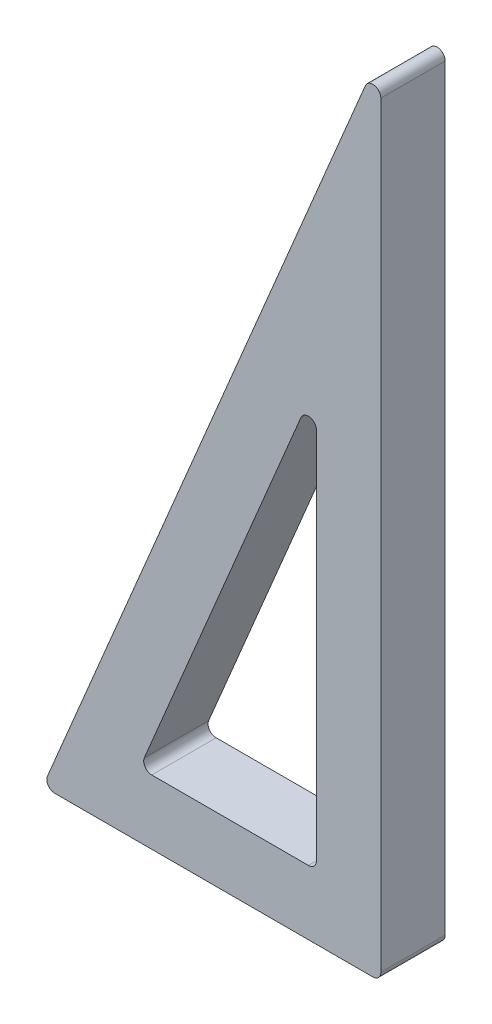
ISO-10303-21;
HEADER;
FILE_DESCRIPTION(('STEP AP214'),'2;1');
FILE_NAME('part.step','',(''),(''),'','','');
FILE_SCHEMA(('AUTOMOTIVE_DESIGN { 1 0 10303 214 1 1 1 1 }'));
ENDSEC;
DATA;
#1=APPLICATION_CONTEXT('core data for automotive mechanical design processes');
#2=APPLICATION_PROTOCOL_DEFINITION('international standard','automotive_design',2000,#1);
#3=PRODUCT_CONTEXT('',#1,'mechanical');
#4=PRODUCT('Part','Part','',(#3));
#5=PRODUCT_RELATED_PRODUCT_CATEGORY('part','',(#4));
#6=PRODUCT_DEFINITION_FORMATION('','',#4);
#7=PRODUCT_DEFINITION_CONTEXT('part definition',#1,'design');
#8=PRODUCT_DEFINITION('design','',#6,#7);
#9=PRODUCT_DEFINITION_SHAPE('','',#8);
#10=(LENGTH_UNIT() NAMED_UNIT(*) SI_UNIT(.MILLI.,.METRE.));
#11=(NAMED_UNIT(*) PLANE_ANGLE_UNIT() SI_UNIT($,.RADIAN.));
#12=(NAMED_UNIT(*) SI_UNIT($,.STERADIAN.) SOLID_ANGLE_UNIT());
#13=UNCERTAINTY_MEASURE_WITH_UNIT(LENGTH_MEASURE(1.E-05),#10,'distance_accuracy_value','');
#14=(GEOMETRIC_REPRESENTATION_CONTEXT(3) GLOBAL_UNCERTAINTY_ASSIGNED_CONTEXT((#13)) GLOBAL_UNIT_ASSIGNED_CONTEXT((#10,
#11,#12)) REPRESENTATION_CONTEXT('',''));
#15=CARTESIAN_POINT('',(0.,0.,0.));
#16=DIRECTION('',(0.,0.,1.));
#17=DIRECTION('',(1.,0.,0.));
#18=AXIS2_PLACEMENT_3D('',#15,#16,#17);
#19=CARTESIAN_POINT('',(21.,0.,8.));
#20=DIRECTION('',(1.,0.,0.));
#21=DIRECTION('',(0.,1.,0.));
#22=AXIS2_PLACEMENT_3D('',#19,#20,#21);
#23=PLANE('',#22);
#24=DIRECTION('',(0.,-1.,0.));
#25=VECTOR('',#24,1.);
#26=CARTESIAN_POINT('',(21.,0.,8.));
#27=LINE('',#26,#25);
#28=CARTESIAN_POINT('',(21.,45.0366196451512,8.));
#29=VERTEX_POINT('',#28);
#30=CARTESIAN_POINT('',(21.,-49.,8.));
#31=VERTEX_POINT('',#30);
#32=EDGE_CURVE('E237',#29,#31,#27,.T.);
#33=ORIENTED_EDGE('',*,*,#32,.T.);
#34=DIRECTION('',(0.,0.,-1.));
#35=VECTOR('',#34,1.);
#36=CARTESIAN_POINT('',(21.,-49.,0.));
#37=LINE('',#36,#35);
#38=CARTESIAN_POINT('',(21.,-49.,0.));
#39=VERTEX_POINT('',#38);
#40=EDGE_CURVE('E139',#31,#39,#37,.T.);
#41=ORIENTED_EDGE('',*,*,#40,.T.);
#42=DIRECTION('',(0.,-1.,0.));
#43=VECTOR('',#42,1.);
#44=CARTESIAN_POINT('',(21.,0.,0.));
#45=LINE('',#44,#43);
#46=CARTESIAN_POINT('',(21.,45.0366196451512,0.));
#47=VERTEX_POINT('',#46);
#48=EDGE_CURVE('E131',#47,#39,#45,.T.);
#49=ORIENTED_EDGE('',*,*,#48,.F.);
#50=DIRECTION('',(0.,0.,-1.));
#51=VECTOR('',#50,1.);
#52=CARTESIAN_POINT('',(21.,45.0366196451512,8.));
#53=LINE('',#52,#51);
#54=EDGE_CURVE('E144',#47,#29,#53,.F.);
#55=ORIENTED_EDGE('',*,*,#54,.T.);
#56=EDGE_LOOP('',(#33,#41,#49,#55));
#57=FACE_BOUND('',#56,.T.);
#58=ADVANCED_FACE('F39',(#57),#23,.T.);
#59=CARTESIAN_POINT('',(0.,0.,8.));
#60=DIRECTION('',(0.921982105607361,-0.387232484355092,0.));
#61=DIRECTION('',(0.387232484355092,0.921982105607361,0.));
#62=AXIS2_PLACEMENT_3D('',#59,#60,#61);
#63=PLANE('',#62);
#64=DIRECTION('',(-0.387232484355092,-0.921982105607361,0.));
#65=VECTOR('',#64,1.);
#66=CARTESIAN_POINT('',(0.,0.,0.));
#67=LINE('',#66,#65);
#68=CARTESIAN_POINT('',(19.0780178943926,45.4238521295063,0.));
#69=VERTEX_POINT('',#68);
#70=CARTESIAN_POINT('',(-20.4173623565708,-48.6127675156449,0.));
#71=VERTEX_POINT('',#70);
#72=EDGE_CURVE('E133',#69,#71,#67,.T.);
#73=ORIENTED_EDGE('',*,*,#72,.T.);
#74=DIRECTION('',(0.,0.,-1.));
#75=VECTOR('',#74,1.);
#76=CARTESIAN_POINT('',(-20.4173623565708,-48.6127675156449,8.));
#77=LINE('',#76,#75);
#78=CARTESIAN_POINT('',(-20.4173623565708,-48.6127675156449,8.));
#79=VERTEX_POINT('',#78);
#80=EDGE_CURVE('E177',#71,#79,#77,.F.);
#81=ORIENTED_EDGE('',*,*,#80,.T.);
#82=DIRECTION('',(-0.387232484355092,-0.921982105607361,0.));
#83=VECTOR('',#82,1.);
#84=CARTESIAN_POINT('',(0.,0.,8.));
#85=LINE('',#84,#83);
#86=CARTESIAN_POINT('',(19.0780178943926,45.4238521295063,8.));
#87=VERTEX_POINT('',#86);
#88=EDGE_CURVE('E156',#87,#79,#85,.T.);
#89=ORIENTED_EDGE('',*,*,#88,.F.);
#90=DIRECTION('',(0.,0.,-1.));
#91=VECTOR('',#90,1.);
#92=CARTESIAN_POINT('',(19.0780178943926,45.4238521295063,0.));
#93=LINE('',#92,#91);
#94=EDGE_CURVE('E175',#87,#69,#93,.T.);
#95=ORIENTED_EDGE('',*,*,#94,.T.);
#96=EDGE_LOOP('',(#73,#81,#89,#95));
#97=FACE_BOUND('',#96,.T.);
#98=ADVANCED_FACE('F256',(#97),#63,.F.);
#99=CARTESIAN_POINT('',(0.,-50.,8.));
#100=DIRECTION('',(0.,1.,0.));
#101=DIRECTION('',(0.,0.,1.));
#102=AXIS2_PLACEMENT_3D('',#99,#100,#101);
#103=PLANE('',#102);
#104=DIRECTION('',(1.,0.,0.));
#105=VECTOR('',#104,1.);
#106=CARTESIAN_POINT('',(0.,-50.,0.));
#107=LINE('',#106,#105);
#108=CARTESIAN_POINT('',(-19.4953802509635,-50.,0.));
#109=VERTEX_POINT('',#108);
#110=CARTESIAN_POINT('',(20.,-50.,0.));
#111=VERTEX_POINT('',#110);
#112=EDGE_CURVE('E159',#109,#111,#107,.T.);
#113=ORIENTED_EDGE('',*,*,#112,.T.);
#114=DIRECTION('',(0.,0.,-1.));
#115=VECTOR('',#114,1.);
#116=CARTESIAN_POINT('',(20.,-50.,8.));
#117=LINE('',#116,#115);
#118=CARTESIAN_POINT('',(20.,-50.,8.));
#119=VERTEX_POINT('',#118);
#120=EDGE_CURVE('E168',#111,#119,#117,.F.);
#121=ORIENTED_EDGE('',*,*,#120,.T.);
#122=DIRECTION('',(1.,0.,0.));
#123=VECTOR('',#122,1.);
#124=CARTESIAN_POINT('',(0.,-50.,8.));
#125=LINE('',#124,#123);
#126=CARTESIAN_POINT('',(-19.4953802509635,-50.,8.));
#127=VERTEX_POINT('',#126);
#128=EDGE_CURVE('E152',#127,#119,#125,.T.);
#129=ORIENTED_EDGE('',*,*,#128,.F.);
#130=DIRECTION('',(0.,0.,-1.));
#131=VECTOR('',#130,1.);
#132=CARTESIAN_POINT('',(-19.4953802509635,-50.,8.));
#133=LINE('',#132,#131);
#134=EDGE_CURVE('E165',#127,#109,#133,.T.);
#135=ORIENTED_EDGE('',*,*,#134,.T.);
#136=EDGE_LOOP('',(#113,#121,#129,#135));
#137=FACE_BOUND('',#136,.T.);
#138=ADVANCED_FACE('F246',(#137),#103,.F.);
#139=CARTESIAN_POINT('',(0.,0.,8.));
#140=DIRECTION('',(0.,0.,1.));
#141=DIRECTION('',(1.,0.,0.));
#142=AXIS2_PLACEMENT_3D('',#139,#140,#141);
#143=PLANE('',#142);
#144=DIRECTION('',(0.,1.,0.));
#145=VECTOR('',#144,1.);
#146=CARTESIAN_POINT('',(13.,0.,8.));
#147=LINE('',#146,#145);
#148=CARTESIAN_POINT('',(13.,-41.,8.));
#149=VERTEX_POINT('',#148);
#150=CARTESIAN_POINT('',(13.,5.32957680636073,8.));
#151=VERTEX_POINT('',#150);
#152=EDGE_CURVE('E222',#149,#151,#147,.T.);
#153=ORIENTED_EDGE('',*,*,#152,.F.);
#154=CARTESIAN_POINT('',(12.,-41.,8.));
#155=DIRECTION('',(0.,0.,1.));
#156=DIRECTION('',(1.,0.,0.));
#157=AXIS2_PLACEMENT_3D('',#154,#155,#156);
#158=CIRCLE('',#157,1.);
#159=CARTESIAN_POINT('',(12.,-42.,8.));
#160=VERTEX_POINT('',#159);
#161=EDGE_CURVE('E204',#149,#160,#158,.F.);
#162=ORIENTED_EDGE('',*,*,#161,.T.);
#163=DIRECTION('',(1.,0.,0.));
#164=VECTOR('',#163,1.);
#165=CARTESIAN_POINT('',(0.,-42.,8.));
#166=LINE('',#165,#164);
#167=CARTESIAN_POINT('',(-7.45842225867148,-42.,8.));
#168=VERTEX_POINT('',#167);
#169=EDGE_CURVE('E147',#168,#160,#166,.T.);
#170=ORIENTED_EDGE('',*,*,#169,.F.);
#171=CARTESIAN_POINT('',(-7.45842225867148,-41.,8.));
#172=DIRECTION('',(0.,0.,1.));
#173=DIRECTION('',(1.,0.,0.));
#174=AXIS2_PLACEMENT_3D('',#171,#172,#173);
#175=CIRCLE('',#174,1.);
#176=CARTESIAN_POINT('',(-8.38040436427884,-40.6127675156449,8.));
#177=VERTEX_POINT('',#176);
#178=EDGE_CURVE('E47',#168,#177,#175,.F.);
#179=ORIENTED_EDGE('',*,*,#178,.T.);
#180=DIRECTION('',(-0.387232484355091,-0.921982105607361,0.));
#181=VECTOR('',#180,1.);
#182=CARTESIAN_POINT('',(7.3758568448589,-3.09785987484073,8.));
#183=LINE('',#182,#181);
#184=CARTESIAN_POINT('',(11.0780178943926,5.71680929071582,8.));
#185=VERTEX_POINT('',#184);
#186=EDGE_CURVE('E214',#185,#177,#183,.T.);
#187=ORIENTED_EDGE('',*,*,#186,.F.);
#188=CARTESIAN_POINT('',(12.,5.32957680636073,8.));
#189=DIRECTION('',(0.,0.,1.));
#190=DIRECTION('',(1.,0.,0.));
#191=AXIS2_PLACEMENT_3D('',#188,#189,#190);
#192=CIRCLE('',#191,1.);
#193=EDGE_CURVE('E200',#185,#151,#192,.F.);
#194=ORIENTED_EDGE('',*,*,#193,.T.);
#195=EDGE_LOOP('',(#153,#162,#170,#179,#187,#194));
#196=FACE_BOUND('',#195,.T.);
#197=ORIENTED_EDGE('',*,*,#128,.T.);
#198=CARTESIAN_POINT('',(20.,-49.,8.));
#199=DIRECTION('',(0.,0.,1.));
#200=DIRECTION('',(1.,0.,0.));
#201=AXIS2_PLACEMENT_3D('',#198,#199,#200);
#202=CIRCLE('',#201,1.);
#203=EDGE_CURVE('E173',#119,#31,#202,.T.);
#204=ORIENTED_EDGE('',*,*,#203,.T.);
#205=ORIENTED_EDGE('',*,*,#32,.F.);
#206=CARTESIAN_POINT('',(20.,45.0366196451512,8.));
#207=DIRECTION('',(0.,0.,1.));
#208=DIRECTION('',(1.,0.,0.));
#209=AXIS2_PLACEMENT_3D('',#206,#207,#208);
#210=CIRCLE('',#209,1.);
#211=EDGE_CURVE('E151',#29,#87,#210,.T.);
#212=ORIENTED_EDGE('',*,*,#211,.T.);
#213=ORIENTED_EDGE('',*,*,#88,.T.);
#214=CARTESIAN_POINT('',(-19.4953802509635,-49.,8.));
#215=DIRECTION('',(0.,0.,1.));
#216=DIRECTION('',(1.,0.,0.));
#217=AXIS2_PLACEMENT_3D('',#214,#215,#216);
#218=CIRCLE('',#217,1.);
#219=EDGE_CURVE('E171',#79,#127,#218,.T.);
#220=ORIENTED_EDGE('',*,*,#219,.T.);
#221=EDGE_LOOP('',(#197,#204,#205,#212,#213,#220));
#222=FACE_BOUND('',#221,.T.);
#223=ADVANCED_FACE('F212',(#196,#222),#143,.T.);
#224=CARTESIAN_POINT('',(0.,0.,0.));
#225=DIRECTION('',(0.,0.,1.));
#226=DIRECTION('',(1.,0.,0.));
#227=AXIS2_PLACEMENT_3D('',#224,#225,#226);
#228=PLANE('',#227);
#229=DIRECTION('',(-0.387232484355091,-0.921982105607361,0.));
#230=VECTOR('',#229,1.);
#231=CARTESIAN_POINT('',(7.3758568448589,-3.09785987484073,0.));
#232=LINE('',#231,#230);
#233=CARTESIAN_POINT('',(11.0780178943926,5.71680929071582,0.));
#234=VERTEX_POINT('',#233);
#235=CARTESIAN_POINT('',(-8.38040436427884,-40.6127675156449,0.));
#236=VERTEX_POINT('',#235);
#237=EDGE_CURVE('E179',#234,#236,#232,.T.);
#238=ORIENTED_EDGE('',*,*,#237,.T.);
#239=CARTESIAN_POINT('',(-7.45842225867148,-41.,0.));
#240=DIRECTION('',(0.,0.,1.));
#241=DIRECTION('',(1.,0.,0.));
#242=AXIS2_PLACEMENT_3D('',#239,#240,#241);
#243=CIRCLE('',#242,1.);
#244=CARTESIAN_POINT('',(-7.45842225867148,-42.,0.));
#245=VERTEX_POINT('',#244);
#246=EDGE_CURVE('E11',#236,#245,#243,.T.);
#247=ORIENTED_EDGE('',*,*,#246,.T.);
#248=DIRECTION('',(1.,0.,0.));
#249=VECTOR('',#248,1.);
#250=CARTESIAN_POINT('',(0.,-42.,0.));
#251=LINE('',#250,#249);
#252=CARTESIAN_POINT('',(12.,-42.,0.));
#253=VERTEX_POINT('',#252);
#254=EDGE_CURVE('E181',#245,#253,#251,.T.);
#255=ORIENTED_EDGE('',*,*,#254,.T.);
#256=CARTESIAN_POINT('',(12.,-41.,0.));
#257=DIRECTION('',(0.,0.,1.));
#258=DIRECTION('',(1.,0.,0.));
#259=AXIS2_PLACEMENT_3D('',#256,#257,#258);
#260=CIRCLE('',#259,1.);
#261=CARTESIAN_POINT('',(13.,-41.,0.));
#262=VERTEX_POINT('',#261);
#263=EDGE_CURVE('E206',#253,#262,#260,.T.);
#264=ORIENTED_EDGE('',*,*,#263,.T.);
#265=DIRECTION('',(0.,1.,0.));
#266=VECTOR('',#265,1.);
#267=CARTESIAN_POINT('',(13.,0.,0.));
#268=LINE('',#267,#266);
#269=CARTESIAN_POINT('',(13.,5.32957680636073,0.));
#270=VERTEX_POINT('',#269);
#271=EDGE_CURVE('E183',#262,#270,#268,.T.);
#272=ORIENTED_EDGE('',*,*,#271,.T.);
#273=CARTESIAN_POINT('',(12.,5.32957680636073,0.));
#274=DIRECTION('',(0.,0.,1.));
#275=DIRECTION('',(1.,0.,0.));
#276=AXIS2_PLACEMENT_3D('',#273,#274,#275);
#277=CIRCLE('',#276,1.);
#278=EDGE_CURVE('E202',#270,#234,#277,.T.);
#279=ORIENTED_EDGE('',*,*,#278,.T.);
#280=EDGE_LOOP('',(#238,#247,#255,#264,#272,#279));
#281=FACE_BOUND('',#280,.T.);
#282=ORIENTED_EDGE('',*,*,#48,.T.);
#283=CARTESIAN_POINT('',(20.,-49.,0.));
#284=DIRECTION('',(0.,0.,1.));
#285=DIRECTION('',(1.,0.,0.));
#286=AXIS2_PLACEMENT_3D('',#283,#284,#285);
#287=CIRCLE('',#286,1.);
#288=EDGE_CURVE('E163',#39,#111,#287,.F.);
#289=ORIENTED_EDGE('',*,*,#288,.T.);
#290=ORIENTED_EDGE('',*,*,#112,.F.);
#291=CARTESIAN_POINT('',(-19.4953802509635,-49.,0.));
#292=DIRECTION('',(0.,0.,1.));
#293=DIRECTION('',(1.,0.,0.));
#294=AXIS2_PLACEMENT_3D('',#291,#292,#293);
#295=CIRCLE('',#294,1.);
#296=EDGE_CURVE('E138',#109,#71,#295,.F.);
#297=ORIENTED_EDGE('',*,*,#296,.T.);
#298=ORIENTED_EDGE('',*,*,#72,.F.);
#299=CARTESIAN_POINT('',(20.,45.0366196451512,0.));
#300=DIRECTION('',(0.,0.,1.));
#301=DIRECTION('',(1.,0.,0.));
#302=AXIS2_PLACEMENT_3D('',#299,#300,#301);
#303=CIRCLE('',#302,1.);
#304=EDGE_CURVE('E128',#69,#47,#303,.F.);
#305=ORIENTED_EDGE('',*,*,#304,.T.);
#306=EDGE_LOOP('',(#282,#289,#290,#297,#298,#305));
#307=FACE_BOUND('',#306,.T.);
#308=ADVANCED_FACE('F130',(#281,#307),#228,.F.);
#309=CARTESIAN_POINT('',(20.,-49.,8.));
#310=DIRECTION('',(0.,0.,1.));
#311=DIRECTION('',(1.,0.,0.));
#312=AXIS2_PLACEMENT_3D('',#309,#310,#311);
#313=CYLINDRICAL_SURFACE('',#312,1.);
#314=ORIENTED_EDGE('',*,*,#203,.F.);
#315=ORIENTED_EDGE('',*,*,#120,.F.);
#316=ORIENTED_EDGE('',*,*,#288,.F.);
#317=ORIENTED_EDGE('',*,*,#40,.F.);
#318=EDGE_LOOP('',(#314,#315,#316,#317));
#319=FACE_BOUND('',#318,.T.);
#320=ADVANCED_FACE('F251',(#319),#313,.T.);
#321=CARTESIAN_POINT('',(-19.4953802509635,-49.,8.));
#322=DIRECTION('',(0.,0.,-1.));
#323=DIRECTION('',(-1.,0.,0.));
#324=AXIS2_PLACEMENT_3D('',#321,#322,#323);
#325=CYLINDRICAL_SURFACE('',#324,1.);
#326=ORIENTED_EDGE('',*,*,#219,.F.);
#327=ORIENTED_EDGE('',*,*,#80,.F.);
#328=ORIENTED_EDGE('',*,*,#296,.F.);
#329=ORIENTED_EDGE('',*,*,#134,.F.);
#330=EDGE_LOOP('',(#326,#327,#328,#329));
#331=FACE_BOUND('',#330,.T.);
#332=ADVANCED_FACE('F254',(#331),#325,.T.);
#333=CARTESIAN_POINT('',(20.,45.0366196451512,8.));
#334=DIRECTION('',(0.,0.,1.));
#335=DIRECTION('',(1.,0.,0.));
#336=AXIS2_PLACEMENT_3D('',#333,#334,#335);
#337=CYLINDRICAL_SURFACE('',#336,1.);
#338=ORIENTED_EDGE('',*,*,#211,.F.);
#339=ORIENTED_EDGE('',*,*,#54,.F.);
#340=ORIENTED_EDGE('',*,*,#304,.F.);
#341=ORIENTED_EDGE('',*,*,#94,.F.);
#342=EDGE_LOOP('',(#338,#339,#340,#341));
#343=FACE_BOUND('',#342,.T.);
#344=ADVANCED_FACE('F150',(#343),#337,.T.);
#345=CARTESIAN_POINT('',(13.,0.,-28.));
#346=DIRECTION('',(1.,0.,0.));
#347=DIRECTION('',(0.,0.,-1.));
#348=AXIS2_PLACEMENT_3D('',#345,#346,#347);
#349=PLANE('',#348);
#350=ORIENTED_EDGE('',*,*,#152,.T.);
#351=DIRECTION('',(0.,0.,1.));
#352=VECTOR('',#351,1.);
#353=CARTESIAN_POINT('',(13.,5.32957680636073,0.));
#354=LINE('',#353,#352);
#355=EDGE_CURVE('E194',#151,#270,#354,.F.);
#356=ORIENTED_EDGE('',*,*,#355,.T.);
#357=ORIENTED_EDGE('',*,*,#271,.F.);
#358=DIRECTION('',(0.,0.,1.));
#359=VECTOR('',#358,1.);
#360=CARTESIAN_POINT('',(13.,-41.,8.));
#361=LINE('',#360,#359);
#362=EDGE_CURVE('E191',#262,#149,#361,.T.);
#363=ORIENTED_EDGE('',*,*,#362,.T.);
#364=EDGE_LOOP('',(#350,#356,#357,#363));
#365=FACE_BOUND('',#364,.T.);
#366=ADVANCED_FACE('F232',(#365),#349,.F.);
#367=CARTESIAN_POINT('',(0.,-42.,-28.));
#368=DIRECTION('',(0.,-1.,0.));
#369=DIRECTION('',(0.,0.,-1.));
#370=AXIS2_PLACEMENT_3D('',#367,#368,#369);
#371=PLANE('',#370);
#372=ORIENTED_EDGE('',*,*,#169,.T.);
#373=DIRECTION('',(0.,0.,1.));
#374=VECTOR('',#373,1.);
#375=CARTESIAN_POINT('',(12.,-42.,0.));
#376=LINE('',#375,#374);
#377=EDGE_CURVE('E54',#160,#253,#376,.F.);
#378=ORIENTED_EDGE('',*,*,#377,.T.);
#379=ORIENTED_EDGE('',*,*,#254,.F.);
#380=DIRECTION('',(0.,0.,1.));
#381=VECTOR('',#380,1.);
#382=CARTESIAN_POINT('',(-7.45842225867148,-42.,8.));
#383=LINE('',#382,#381);
#384=EDGE_CURVE('E196',#245,#168,#383,.T.);
#385=ORIENTED_EDGE('',*,*,#384,.T.);
#386=EDGE_LOOP('',(#372,#378,#379,#385));
#387=FACE_BOUND('',#386,.T.);
#388=ADVANCED_FACE('F224',(#387),#371,.F.);
#389=CARTESIAN_POINT('',(7.3758568448589,-3.09785987484073,-28.));
#390=DIRECTION('',(-0.921982105607361,0.387232484355091,0.));
#391=DIRECTION('',(-0.387232484355091,-0.921982105607361,0.));
#392=AXIS2_PLACEMENT_3D('',#389,#390,#391);
#393=PLANE('',#392);
#394=ORIENTED_EDGE('',*,*,#237,.F.);
#395=DIRECTION('',(0.,0.,1.));
#396=VECTOR('',#395,1.);
#397=CARTESIAN_POINT('',(11.0780178943926,5.71680929071582,8.));
#398=LINE('',#397,#396);
#399=EDGE_CURVE('E188',#234,#185,#398,.T.);
#400=ORIENTED_EDGE('',*,*,#399,.T.);
#401=ORIENTED_EDGE('',*,*,#186,.T.);
#402=DIRECTION('',(0.,0.,1.));
#403=VECTOR('',#402,1.);
#404=CARTESIAN_POINT('',(-8.38040436427884,-40.6127675156449,0.));
#405=LINE('',#404,#403);
#406=EDGE_CURVE('E186',#177,#236,#405,.F.);
#407=ORIENTED_EDGE('',*,*,#406,.T.);
#408=EDGE_LOOP('',(#394,#400,#401,#407));
#409=FACE_BOUND('',#408,.T.);
#410=ADVANCED_FACE('F220',(#409),#393,.F.);
#411=CARTESIAN_POINT('',(12.,5.32957680636073,-28.));
#412=DIRECTION('',(0.,0.,-1.));
#413=DIRECTION('',(-1.,0.,0.));
#414=AXIS2_PLACEMENT_3D('',#411,#412,#413);
#415=CYLINDRICAL_SURFACE('',#414,1.);
#416=ORIENTED_EDGE('',*,*,#278,.F.);
#417=ORIENTED_EDGE('',*,*,#355,.F.);
#418=ORIENTED_EDGE('',*,*,#193,.F.);
#419=ORIENTED_EDGE('',*,*,#399,.F.);
#420=EDGE_LOOP('',(#416,#417,#418,#419));
#421=FACE_BOUND('',#420,.T.);
#422=ADVANCED_FACE('F273',(#421),#415,.F.);
#423=CARTESIAN_POINT('',(12.,-41.,-28.));
#424=DIRECTION('',(0.,0.,-1.));
#425=DIRECTION('',(-1.,0.,0.));
#426=AXIS2_PLACEMENT_3D('',#423,#424,#425);
#427=CYLINDRICAL_SURFACE('',#426,1.);
#428=ORIENTED_EDGE('',*,*,#263,.F.);
#429=ORIENTED_EDGE('',*,*,#377,.F.);
#430=ORIENTED_EDGE('',*,*,#161,.F.);
#431=ORIENTED_EDGE('',*,*,#362,.F.);
#432=EDGE_LOOP('',(#428,#429,#430,#431));
#433=FACE_BOUND('',#432,.T.);
#434=ADVANCED_FACE('F229',(#433),#427,.F.);
#435=CARTESIAN_POINT('',(-7.45842225867148,-41.,-28.));
#436=DIRECTION('',(0.,0.,-1.));
#437=DIRECTION('',(-1.,0.,0.));
#438=AXIS2_PLACEMENT_3D('',#435,#436,#437);
#439=CYLINDRICAL_SURFACE('',#438,1.);
#440=ORIENTED_EDGE('',*,*,#246,.F.);
#441=ORIENTED_EDGE('',*,*,#406,.F.);
#442=ORIENTED_EDGE('',*,*,#178,.F.);
#443=ORIENTED_EDGE('',*,*,#384,.F.);
#444=EDGE_LOOP('',(#440,#441,#442,#443));
#445=FACE_BOUND('',#444,.T.);
#446=ADVANCED_FACE('F41',(#445),#439,.F.);
#447=CLOSED_SHELL('',(#58,#98,#138,#223,#308,#320,#332,#344,#366,#388,#410,#422,#434,#446));
#448=MANIFOLD_SOLID_BREP('B2',#447);
#449=ADVANCED_BREP_SHAPE_REPRESENTATION('',(#18,#448),#14);
#450=SHAPE_DEFINITION_REPRESENTATION(#9,#449);
ENDSEC;
END-ISO-10303-21;
